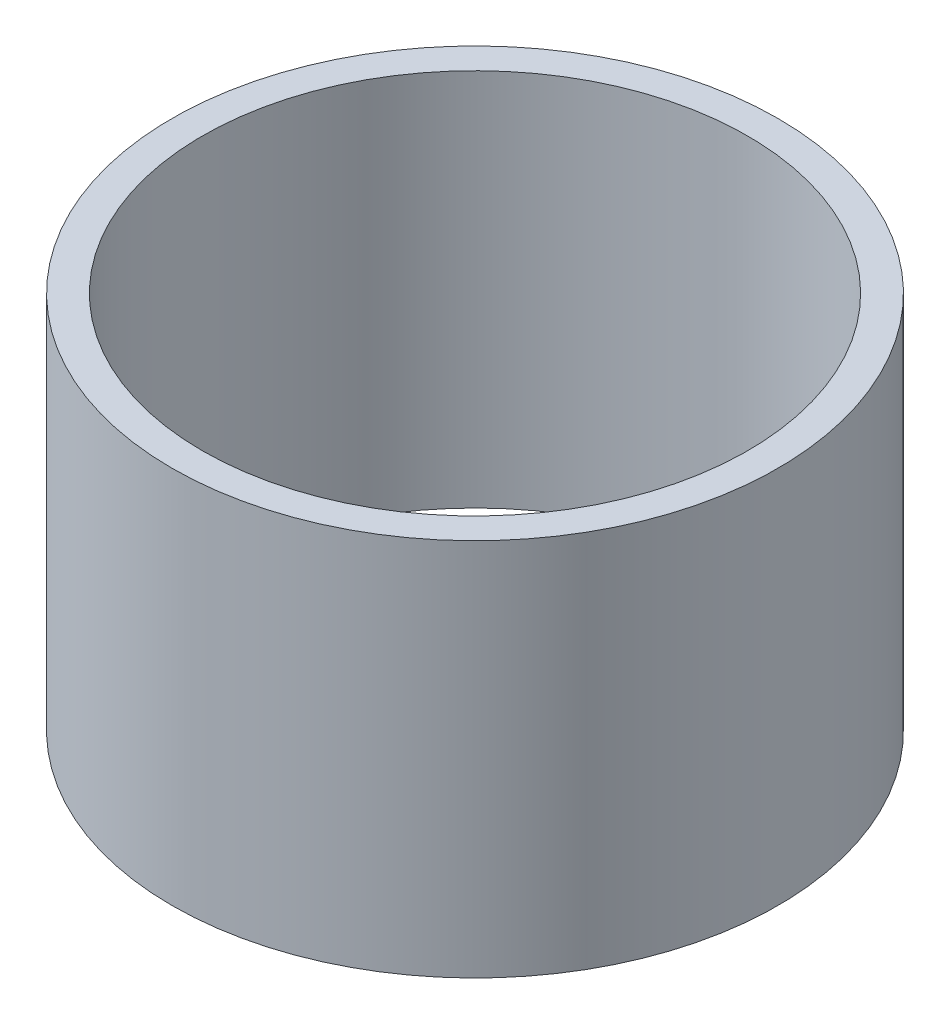
ISO-10303-21;
HEADER;
FILE_DESCRIPTION(('STEP AP214'),'2;1');
FILE_NAME('part.step','',(''),(''),'','','');
FILE_SCHEMA(('AUTOMOTIVE_DESIGN { 1 0 10303 214 1 1 1 1 }'));
ENDSEC;
DATA;
#1=APPLICATION_CONTEXT('core data for automotive mechanical design processes');
#2=APPLICATION_PROTOCOL_DEFINITION('international standard','automotive_design',2000,#1);
#3=PRODUCT_CONTEXT('',#1,'mechanical');
#4=PRODUCT('Part','Part','',(#3));
#5=PRODUCT_RELATED_PRODUCT_CATEGORY('part','',(#4));
#6=PRODUCT_DEFINITION_FORMATION('','',#4);
#7=PRODUCT_DEFINITION_CONTEXT('part definition',#1,'design');
#8=PRODUCT_DEFINITION('design','',#6,#7);
#9=PRODUCT_DEFINITION_SHAPE('','',#8);
#10=(LENGTH_UNIT() NAMED_UNIT(*) SI_UNIT(.MILLI.,.METRE.));
#11=(NAMED_UNIT(*) PLANE_ANGLE_UNIT() SI_UNIT($,.RADIAN.));
#12=(NAMED_UNIT(*) SI_UNIT($,.STERADIAN.) SOLID_ANGLE_UNIT());
#13=UNCERTAINTY_MEASURE_WITH_UNIT(LENGTH_MEASURE(1.E-05),#10,'distance_accuracy_value','');
#14=(GEOMETRIC_REPRESENTATION_CONTEXT(3) GLOBAL_UNCERTAINTY_ASSIGNED_CONTEXT((#13)) GLOBAL_UNIT_ASSIGNED_CONTEXT((#10,
#11,#12)) REPRESENTATION_CONTEXT('',''));
#15=CARTESIAN_POINT('',(0.,0.,0.));
#16=DIRECTION('',(0.,0.,1.));
#17=DIRECTION('',(1.,0.,0.));
#18=AXIS2_PLACEMENT_3D('',#15,#16,#17);
#19=CARTESIAN_POINT('',(0.,50.,0.));
#20=DIRECTION('',(0.,1.,0.));
#21=DIRECTION('',(0.,0.,1.));
#22=AXIS2_PLACEMENT_3D('',#19,#20,#21);
#23=PLANE('',#22);
#24=CARTESIAN_POINT('',(0.,50.,0.));
#25=DIRECTION('',(0.,1.,0.));
#26=DIRECTION('',(0.,0.,1.));
#27=AXIS2_PLACEMENT_3D('',#24,#25,#26);
#28=CIRCLE('',#27,40.);
#29=CARTESIAN_POINT('',(0.,50.,40.));
#30=VERTEX_POINT('',#29);
#31=EDGE_CURVE('E10',#30,#30,#28,.T.);
#32=ORIENTED_EDGE('',*,*,#31,.T.);
#33=EDGE_LOOP('',(#32));
#34=FACE_BOUND('',#33,.T.);
#35=CARTESIAN_POINT('',(0.,50.,0.));
#36=DIRECTION('',(0.,1.,0.));
#37=DIRECTION('',(0.,0.,1.));
#38=AXIS2_PLACEMENT_3D('',#35,#36,#37);
#39=CIRCLE('',#38,36.);
#40=CARTESIAN_POINT('',(0.,50.,36.));
#41=VERTEX_POINT('',#40);
#42=EDGE_CURVE('E46',#41,#41,#39,.T.);
#43=ORIENTED_EDGE('',*,*,#42,.F.);
#44=EDGE_LOOP('',(#43));
#45=FACE_BOUND('',#44,.T.);
#46=ADVANCED_FACE('F35',(#34,#45),#23,.T.);
#47=CARTESIAN_POINT('',(0.,0.,0.));
#48=DIRECTION('',(0.,1.,0.));
#49=DIRECTION('',(0.,0.,1.));
#50=AXIS2_PLACEMENT_3D('',#47,#48,#49);
#51=PLANE('',#50);
#52=CARTESIAN_POINT('',(0.,0.,0.));
#53=DIRECTION('',(0.,1.,0.));
#54=DIRECTION('',(0.,0.,1.));
#55=AXIS2_PLACEMENT_3D('',#52,#53,#54);
#56=CIRCLE('',#55,40.);
#57=CARTESIAN_POINT('',(0.,0.,40.));
#58=VERTEX_POINT('',#57);
#59=EDGE_CURVE('E39',#58,#58,#56,.T.);
#60=ORIENTED_EDGE('',*,*,#59,.F.);
#61=EDGE_LOOP('',(#60));
#62=FACE_BOUND('',#61,.T.);
#63=CARTESIAN_POINT('',(0.,0.,0.));
#64=DIRECTION('',(0.,1.,0.));
#65=DIRECTION('',(0.,0.,1.));
#66=AXIS2_PLACEMENT_3D('',#63,#64,#65);
#67=CIRCLE('',#66,36.);
#68=CARTESIAN_POINT('',(0.,0.,36.));
#69=VERTEX_POINT('',#68);
#70=EDGE_CURVE('E48',#69,#69,#67,.T.);
#71=ORIENTED_EDGE('',*,*,#70,.T.);
#72=EDGE_LOOP('',(#71));
#73=FACE_BOUND('',#72,.T.);
#74=ADVANCED_FACE('F58',(#62,#73),#51,.F.);
#75=CARTESIAN_POINT('',(0.,50.,0.));
#76=DIRECTION('',(0.,-1.,0.));
#77=DIRECTION('',(0.,0.,-1.));
#78=AXIS2_PLACEMENT_3D('',#75,#76,#77);
#79=CYLINDRICAL_SURFACE('',#78,40.);
#80=ORIENTED_EDGE('',*,*,#31,.F.);
#81=EDGE_LOOP('',(#80));
#82=FACE_BOUND('',#81,.T.);
#83=ORIENTED_EDGE('',*,*,#59,.T.);
#84=EDGE_LOOP('',(#83));
#85=FACE_BOUND('',#84,.T.);
#86=ADVANCED_FACE('F37',(#82,#85),#79,.T.);
#87=CARTESIAN_POINT('',(0.,50.,0.));
#88=DIRECTION('',(0.,-1.,0.));
#89=DIRECTION('',(0.,0.,-1.));
#90=AXIS2_PLACEMENT_3D('',#87,#88,#89);
#91=CYLINDRICAL_SURFACE('',#90,36.);
#92=ORIENTED_EDGE('',*,*,#42,.T.);
#93=EDGE_LOOP('',(#92));
#94=FACE_BOUND('',#93,.T.);
#95=ORIENTED_EDGE('',*,*,#70,.F.);
#96=EDGE_LOOP('',(#95));
#97=FACE_BOUND('',#96,.T.);
#98=ADVANCED_FACE('F54',(#94,#97),#91,.F.);
#99=CLOSED_SHELL('',(#46,#74,#86,#98));
#100=MANIFOLD_SOLID_BREP('B2',#99);
#101=ADVANCED_BREP_SHAPE_REPRESENTATION('',(#18,#100),#14);
#102=SHAPE_DEFINITION_REPRESENTATION(#9,#101);
ENDSEC;
END-ISO-10303-21;
